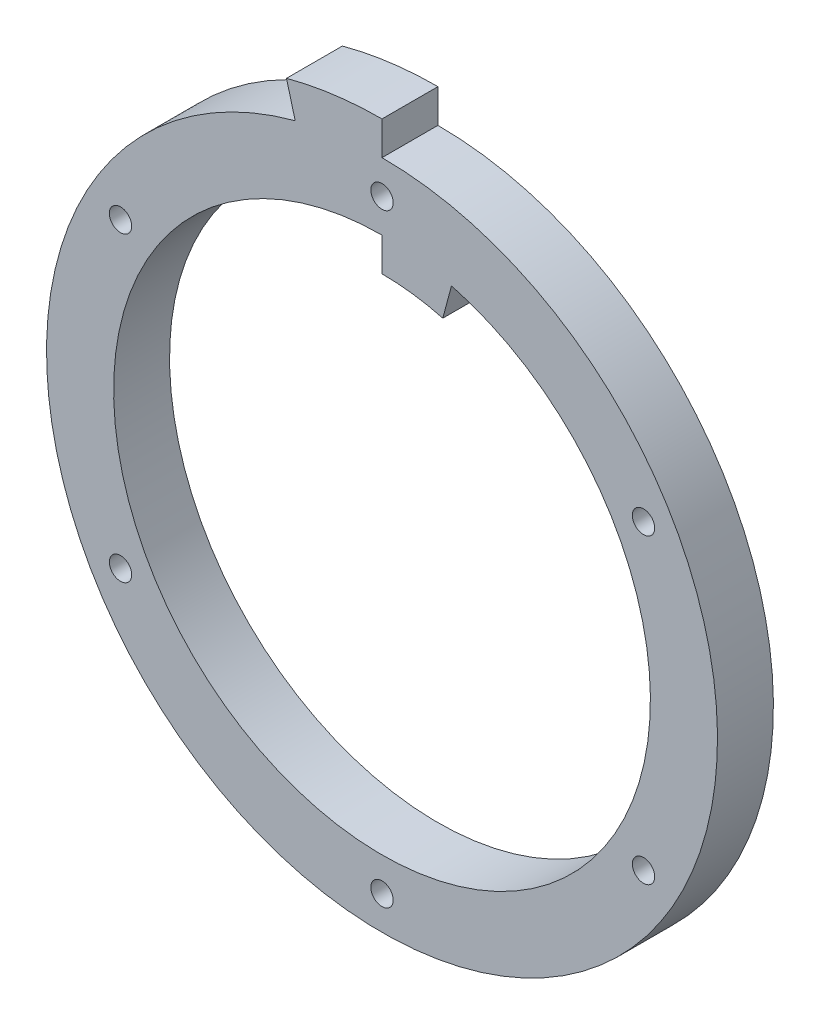
ISO-10303-21;
HEADER;
FILE_DESCRIPTION(('STEP AP214'),'2;1');
FILE_NAME('part.step','',(''),(''),'','','');
FILE_SCHEMA(('AUTOMOTIVE_DESIGN { 1 0 10303 214 1 1 1 1 }'));
ENDSEC;
DATA;
#1=APPLICATION_CONTEXT('core data for automotive mechanical design processes');
#2=APPLICATION_PROTOCOL_DEFINITION('international standard','automotive_design',2000,#1);
#3=PRODUCT_CONTEXT('',#1,'mechanical');
#4=PRODUCT('Part','Part','',(#3));
#5=PRODUCT_RELATED_PRODUCT_CATEGORY('part','',(#4));
#6=PRODUCT_DEFINITION_FORMATION('','',#4);
#7=PRODUCT_DEFINITION_CONTEXT('part definition',#1,'design');
#8=PRODUCT_DEFINITION('design','',#6,#7);
#9=PRODUCT_DEFINITION_SHAPE('','',#8);
#10=(LENGTH_UNIT() NAMED_UNIT(*) SI_UNIT(.MILLI.,.METRE.));
#11=(NAMED_UNIT(*) PLANE_ANGLE_UNIT() SI_UNIT($,.RADIAN.));
#12=(NAMED_UNIT(*) SI_UNIT($,.STERADIAN.) SOLID_ANGLE_UNIT());
#13=UNCERTAINTY_MEASURE_WITH_UNIT(LENGTH_MEASURE(1.E-05),#10,'distance_accuracy_value','');
#14=(GEOMETRIC_REPRESENTATION_CONTEXT(3) GLOBAL_UNCERTAINTY_ASSIGNED_CONTEXT((#13)) GLOBAL_UNIT_ASSIGNED_CONTEXT((#10,
#11,#12)) REPRESENTATION_CONTEXT('',''));
#15=CARTESIAN_POINT('',(0.,0.,0.));
#16=DIRECTION('',(0.,0.,1.));
#17=DIRECTION('',(1.,0.,0.));
#18=AXIS2_PLACEMENT_3D('',#15,#16,#17);
#19=CARTESIAN_POINT('',(0.,0.,5.));
#20=DIRECTION('',(0.,0.,1.));
#21=DIRECTION('',(1.,0.,0.));
#22=AXIS2_PLACEMENT_3D('',#19,#20,#21);
#23=PLANE('',#22);
#24=CARTESIAN_POINT('',(0.,27.,5.));
#25=DIRECTION('',(0.,0.,1.));
#26=DIRECTION('',(1.,0.,0.));
#27=AXIS2_PLACEMENT_3D('',#24,#25,#26);
#28=CIRCLE('',#27,1.);
#29=CARTESIAN_POINT('',(1.,27.,5.));
#30=VERTEX_POINT('',#29);
#31=EDGE_CURVE('E162',#30,#30,#28,.T.);
#32=ORIENTED_EDGE('',*,*,#31,.F.);
#33=EDGE_LOOP('',(#32));
#34=FACE_BOUND('',#33,.T.);
#35=CARTESIAN_POINT('',(-23.3826859021798,13.5,5.));
#36=DIRECTION('',(0.,0.,1.));
#37=DIRECTION('',(1.,0.,0.));
#38=AXIS2_PLACEMENT_3D('',#35,#36,#37);
#39=CIRCLE('',#38,1.);
#40=CARTESIAN_POINT('',(-22.3826859021798,13.5,5.));
#41=VERTEX_POINT('',#40);
#42=EDGE_CURVE('E166',#41,#41,#39,.T.);
#43=ORIENTED_EDGE('',*,*,#42,.F.);
#44=EDGE_LOOP('',(#43));
#45=FACE_BOUND('',#44,.T.);
#46=CARTESIAN_POINT('',(-23.3826859021798,-13.5,5.));
#47=DIRECTION('',(0.,0.,1.));
#48=DIRECTION('',(1.,0.,0.));
#49=AXIS2_PLACEMENT_3D('',#46,#47,#48);
#50=CIRCLE('',#49,1.);
#51=CARTESIAN_POINT('',(-22.3826859021798,-13.5,5.));
#52=VERTEX_POINT('',#51);
#53=EDGE_CURVE('E189',#52,#52,#50,.T.);
#54=ORIENTED_EDGE('',*,*,#53,.F.);
#55=EDGE_LOOP('',(#54));
#56=FACE_BOUND('',#55,.T.);
#57=CARTESIAN_POINT('',(0.,-27.,5.));
#58=DIRECTION('',(0.,0.,1.));
#59=DIRECTION('',(1.,0.,0.));
#60=AXIS2_PLACEMENT_3D('',#57,#58,#59);
#61=CIRCLE('',#60,1.);
#62=CARTESIAN_POINT('',(1.,-27.,5.));
#63=VERTEX_POINT('',#62);
#64=EDGE_CURVE('E183',#63,#63,#61,.T.);
#65=ORIENTED_EDGE('',*,*,#64,.F.);
#66=EDGE_LOOP('',(#65));
#67=FACE_BOUND('',#66,.T.);
#68=CARTESIAN_POINT('',(23.3826859021798,-13.5,5.));
#69=DIRECTION('',(0.,0.,1.));
#70=DIRECTION('',(1.,0.,0.));
#71=AXIS2_PLACEMENT_3D('',#68,#69,#70);
#72=CIRCLE('',#71,1.);
#73=CARTESIAN_POINT('',(24.3826859021798,-13.5,5.));
#74=VERTEX_POINT('',#73);
#75=EDGE_CURVE('E177',#74,#74,#72,.T.);
#76=ORIENTED_EDGE('',*,*,#75,.F.);
#77=EDGE_LOOP('',(#76));
#78=FACE_BOUND('',#77,.T.);
#79=CARTESIAN_POINT('',(23.3826859021798,13.5,5.));
#80=DIRECTION('',(0.,0.,1.));
#81=DIRECTION('',(1.,0.,0.));
#82=AXIS2_PLACEMENT_3D('',#79,#80,#81);
#83=CIRCLE('',#82,1.);
#84=CARTESIAN_POINT('',(24.3826859021798,13.5,5.));
#85=VERTEX_POINT('',#84);
#86=EDGE_CURVE('E165',#85,#85,#83,.T.);
#87=ORIENTED_EDGE('',*,*,#86,.F.);
#88=EDGE_LOOP('',(#87));
#89=FACE_BOUND('',#88,.T.);
#90=CARTESIAN_POINT('',(0.,0.,5.));
#91=DIRECTION('',(0.,0.,1.));
#92=DIRECTION('',(1.,0.,0.));
#93=AXIS2_PLACEMENT_3D('',#90,#91,#92);
#94=CIRCLE('',#93,30.);
#95=CARTESIAN_POINT('',(-7.76457135307565,28.977774788672,5.));
#96=VERTEX_POINT('',#95);
#97=CARTESIAN_POINT('',(0.,30.,5.));
#98=VERTEX_POINT('',#97);
#99=EDGE_CURVE('E11',#96,#98,#94,.T.);
#100=ORIENTED_EDGE('',*,*,#99,.T.);
#101=DIRECTION('',(0.,1.,0.));
#102=VECTOR('',#101,1.);
#103=CARTESIAN_POINT('',(0.,30.,5.));
#104=LINE('',#103,#102);
#105=CARTESIAN_POINT('',(0.,33.,5.));
#106=VERTEX_POINT('',#105);
#107=EDGE_CURVE('E119',#98,#106,#104,.T.);
#108=ORIENTED_EDGE('',*,*,#107,.T.);
#109=CARTESIAN_POINT('',(0.,0.,5.));
#110=DIRECTION('',(0.,0.,1.));
#111=DIRECTION('',(1.,0.,0.));
#112=AXIS2_PLACEMENT_3D('',#109,#110,#111);
#113=CIRCLE('',#112,33.);
#114=CARTESIAN_POINT('',(-8.54102848838322,31.8755522675392,5.));
#115=VERTEX_POINT('',#114);
#116=EDGE_CURVE('E145',#106,#115,#113,.T.);
#117=ORIENTED_EDGE('',*,*,#116,.T.);
#118=DIRECTION('',(0.258819045102522,-0.965925826289068,0.));
#119=VECTOR('',#118,1.);
#120=CARTESIAN_POINT('',(-7.76457135307565,28.977774788672,5.));
#121=LINE('',#120,#119);
#122=EDGE_CURVE('E137',#115,#96,#121,.T.);
#123=ORIENTED_EDGE('',*,*,#122,.T.);
#124=EDGE_LOOP('',(#100,#108,#117,#123));
#125=FACE_BOUND('',#124,.T.);
#126=CARTESIAN_POINT('',(0.,0.,5.));
#127=DIRECTION('',(0.,0.,1.));
#128=DIRECTION('',(1.,0.,0.));
#129=AXIS2_PLACEMENT_3D('',#126,#127,#128);
#130=CIRCLE('',#129,24.);
#131=CARTESIAN_POINT('',(0.,24.,5.));
#132=VERTEX_POINT('',#131);
#133=CARTESIAN_POINT('',(6.21165708246034,23.1822198309377,5.));
#134=VERTEX_POINT('',#133);
#135=EDGE_CURVE('E122',#132,#134,#130,.T.);
#136=ORIENTED_EDGE('',*,*,#135,.F.);
#137=DIRECTION('',(0.,-1.,0.));
#138=VECTOR('',#137,1.);
#139=CARTESIAN_POINT('',(0.,24.,5.));
#140=LINE('',#139,#138);
#141=CARTESIAN_POINT('',(0.,21.,5.));
#142=VERTEX_POINT('',#141);
#143=EDGE_CURVE('E104',#132,#142,#140,.T.);
#144=ORIENTED_EDGE('',*,*,#143,.T.);
#145=CARTESIAN_POINT('',(0.,0.,5.));
#146=DIRECTION('',(0.,0.,-1.));
#147=DIRECTION('',(1.,0.,0.));
#148=AXIS2_PLACEMENT_3D('',#145,#146,#147);
#149=CIRCLE('',#148,21.);
#150=CARTESIAN_POINT('',(5.4351999471528,20.2844423520705,5.));
#151=VERTEX_POINT('',#150);
#152=EDGE_CURVE('E113',#142,#151,#149,.T.);
#153=ORIENTED_EDGE('',*,*,#152,.T.);
#154=DIRECTION('',(0.258819045102514,0.96592582628907,0.));
#155=VECTOR('',#154,1.);
#156=CARTESIAN_POINT('',(5.4351999471528,20.2844423520705,5.));
#157=LINE('',#156,#155);
#158=EDGE_CURVE('E120',#151,#134,#157,.T.);
#159=ORIENTED_EDGE('',*,*,#158,.T.);
#160=EDGE_LOOP('',(#136,#144,#153,#159));
#161=FACE_BOUND('',#160,.T.);
#162=ADVANCED_FACE('F36',(#34,#45,#56,#67,#78,#89,#125,#161),#23,.T.);
#163=CARTESIAN_POINT('',(0.,0.,0.));
#164=DIRECTION('',(0.,0.,1.));
#165=DIRECTION('',(1.,0.,0.));
#166=AXIS2_PLACEMENT_3D('',#163,#164,#165);
#167=PLANE('',#166);
#168=CARTESIAN_POINT('',(0.,27.,0.));
#169=DIRECTION('',(0.,0.,1.));
#170=DIRECTION('',(1.,0.,0.));
#171=AXIS2_PLACEMENT_3D('',#168,#169,#170);
#172=CIRCLE('',#171,1.);
#173=CARTESIAN_POINT('',(1.,27.,0.));
#174=VERTEX_POINT('',#173);
#175=EDGE_CURVE('E159',#174,#174,#172,.T.);
#176=ORIENTED_EDGE('',*,*,#175,.T.);
#177=EDGE_LOOP('',(#176));
#178=FACE_BOUND('',#177,.T.);
#179=CARTESIAN_POINT('',(-23.3826859021798,13.5,0.));
#180=DIRECTION('',(0.,0.,1.));
#181=DIRECTION('',(1.,0.,0.));
#182=AXIS2_PLACEMENT_3D('',#179,#180,#181);
#183=CIRCLE('',#182,1.);
#184=CARTESIAN_POINT('',(-22.3826859021798,13.5,0.));
#185=VERTEX_POINT('',#184);
#186=EDGE_CURVE('E152',#185,#185,#183,.T.);
#187=ORIENTED_EDGE('',*,*,#186,.T.);
#188=EDGE_LOOP('',(#187));
#189=FACE_BOUND('',#188,.T.);
#190=CARTESIAN_POINT('',(-23.3826859021798,-13.5,0.));
#191=DIRECTION('',(0.,0.,1.));
#192=DIRECTION('',(1.,0.,0.));
#193=AXIS2_PLACEMENT_3D('',#190,#191,#192);
#194=CIRCLE('',#193,1.);
#195=CARTESIAN_POINT('',(-22.3826859021798,-13.5,0.));
#196=VERTEX_POINT('',#195);
#197=EDGE_CURVE('E169',#196,#196,#194,.T.);
#198=ORIENTED_EDGE('',*,*,#197,.T.);
#199=EDGE_LOOP('',(#198));
#200=FACE_BOUND('',#199,.T.);
#201=CARTESIAN_POINT('',(0.,-27.,0.));
#202=DIRECTION('',(0.,0.,1.));
#203=DIRECTION('',(1.,0.,0.));
#204=AXIS2_PLACEMENT_3D('',#201,#202,#203);
#205=CIRCLE('',#204,1.);
#206=CARTESIAN_POINT('',(1.,-27.,0.));
#207=VERTEX_POINT('',#206);
#208=EDGE_CURVE('E186',#207,#207,#205,.T.);
#209=ORIENTED_EDGE('',*,*,#208,.T.);
#210=EDGE_LOOP('',(#209));
#211=FACE_BOUND('',#210,.T.);
#212=CARTESIAN_POINT('',(23.3826859021798,-13.5,0.));
#213=DIRECTION('',(0.,0.,1.));
#214=DIRECTION('',(1.,0.,0.));
#215=AXIS2_PLACEMENT_3D('',#212,#213,#214);
#216=CIRCLE('',#215,1.);
#217=CARTESIAN_POINT('',(24.3826859021798,-13.5,0.));
#218=VERTEX_POINT('',#217);
#219=EDGE_CURVE('E180',#218,#218,#216,.T.);
#220=ORIENTED_EDGE('',*,*,#219,.T.);
#221=EDGE_LOOP('',(#220));
#222=FACE_BOUND('',#221,.T.);
#223=CARTESIAN_POINT('',(23.3826859021798,13.5,0.));
#224=DIRECTION('',(0.,0.,1.));
#225=DIRECTION('',(1.,0.,0.));
#226=AXIS2_PLACEMENT_3D('',#223,#224,#225);
#227=CIRCLE('',#226,1.);
#228=CARTESIAN_POINT('',(24.3826859021798,13.5,0.));
#229=VERTEX_POINT('',#228);
#230=EDGE_CURVE('E174',#229,#229,#227,.T.);
#231=ORIENTED_EDGE('',*,*,#230,.T.);
#232=EDGE_LOOP('',(#231));
#233=FACE_BOUND('',#232,.T.);
#234=CARTESIAN_POINT('',(0.,0.,0.));
#235=DIRECTION('',(0.,0.,1.));
#236=DIRECTION('',(1.,0.,0.));
#237=AXIS2_PLACEMENT_3D('',#234,#235,#236);
#238=CIRCLE('',#237,30.);
#239=CARTESIAN_POINT('',(-7.76457135307565,28.977774788672,0.));
#240=VERTEX_POINT('',#239);
#241=CARTESIAN_POINT('',(0.,30.,0.));
#242=VERTEX_POINT('',#241);
#243=EDGE_CURVE('E40',#240,#242,#238,.T.);
#244=ORIENTED_EDGE('',*,*,#243,.F.);
#245=DIRECTION('',(0.258819045102522,-0.965925826289068,0.));
#246=VECTOR('',#245,1.);
#247=CARTESIAN_POINT('',(-7.76457135307565,28.977774788672,0.));
#248=LINE('',#247,#246);
#249=CARTESIAN_POINT('',(-8.54102848838322,31.8755522675392,0.));
#250=VERTEX_POINT('',#249);
#251=EDGE_CURVE('E140',#250,#240,#248,.T.);
#252=ORIENTED_EDGE('',*,*,#251,.F.);
#253=CARTESIAN_POINT('',(0.,0.,0.));
#254=DIRECTION('',(0.,0.,1.));
#255=DIRECTION('',(1.,0.,0.));
#256=AXIS2_PLACEMENT_3D('',#253,#254,#255);
#257=CIRCLE('',#256,33.);
#258=CARTESIAN_POINT('',(0.,33.,0.));
#259=VERTEX_POINT('',#258);
#260=EDGE_CURVE('E136',#259,#250,#257,.T.);
#261=ORIENTED_EDGE('',*,*,#260,.F.);
#262=DIRECTION('',(0.,1.,0.));
#263=VECTOR('',#262,1.);
#264=CARTESIAN_POINT('',(0.,30.,0.));
#265=LINE('',#264,#263);
#266=EDGE_CURVE('E133',#242,#259,#265,.T.);
#267=ORIENTED_EDGE('',*,*,#266,.F.);
#268=EDGE_LOOP('',(#244,#252,#261,#267));
#269=FACE_BOUND('',#268,.T.);
#270=CARTESIAN_POINT('',(0.,0.,0.));
#271=DIRECTION('',(0.,0.,1.));
#272=DIRECTION('',(1.,0.,0.));
#273=AXIS2_PLACEMENT_3D('',#270,#271,#272);
#274=CIRCLE('',#273,24.);
#275=CARTESIAN_POINT('',(0.,24.,0.));
#276=VERTEX_POINT('',#275);
#277=CARTESIAN_POINT('',(6.21165708246034,23.1822198309377,0.));
#278=VERTEX_POINT('',#277);
#279=EDGE_CURVE('E51',#276,#278,#274,.T.);
#280=ORIENTED_EDGE('',*,*,#279,.T.);
#281=DIRECTION('',(0.258819045102514,0.96592582628907,0.));
#282=VECTOR('',#281,1.);
#283=CARTESIAN_POINT('',(5.4351999471528,20.2844423520705,0.));
#284=LINE('',#283,#282);
#285=CARTESIAN_POINT('',(5.4351999471528,20.2844423520705,0.));
#286=VERTEX_POINT('',#285);
#287=EDGE_CURVE('E126',#286,#278,#284,.T.);
#288=ORIENTED_EDGE('',*,*,#287,.F.);
#289=CARTESIAN_POINT('',(0.,0.,0.));
#290=DIRECTION('',(0.,0.,-1.));
#291=DIRECTION('',(1.,0.,0.));
#292=AXIS2_PLACEMENT_3D('',#289,#290,#291);
#293=CIRCLE('',#292,21.);
#294=CARTESIAN_POINT('',(0.,21.,0.));
#295=VERTEX_POINT('',#294);
#296=EDGE_CURVE('E123',#295,#286,#293,.T.);
#297=ORIENTED_EDGE('',*,*,#296,.F.);
#298=DIRECTION('',(0.,-1.,0.));
#299=VECTOR('',#298,1.);
#300=CARTESIAN_POINT('',(0.,24.,0.));
#301=LINE('',#300,#299);
#302=EDGE_CURVE('E106',#276,#295,#301,.T.);
#303=ORIENTED_EDGE('',*,*,#302,.F.);
#304=EDGE_LOOP('',(#280,#288,#297,#303));
#305=FACE_BOUND('',#304,.T.);
#306=ADVANCED_FACE('F197',(#178,#189,#200,#211,#222,#233,#269,#305),#167,.F.);
#307=CARTESIAN_POINT('',(0.,0.,5.));
#308=DIRECTION('',(0.,0.,-1.));
#309=DIRECTION('',(-1.,0.,0.));
#310=AXIS2_PLACEMENT_3D('',#307,#308,#309);
#311=CYLINDRICAL_SURFACE('',#310,30.);
#312=ORIENTED_EDGE('',*,*,#99,.F.);
#313=DIRECTION('',(0.,0.,1.));
#314=VECTOR('',#313,1.);
#315=CARTESIAN_POINT('',(-7.76457135307565,28.977774788672,0.));
#316=LINE('',#315,#314);
#317=EDGE_CURVE('E149',#240,#96,#316,.T.);
#318=ORIENTED_EDGE('',*,*,#317,.F.);
#319=ORIENTED_EDGE('',*,*,#243,.T.);
#320=DIRECTION('',(0.,0.,1.));
#321=VECTOR('',#320,1.);
#322=CARTESIAN_POINT('',(0.,30.,0.));
#323=LINE('',#322,#321);
#324=EDGE_CURVE('E142',#242,#98,#323,.T.);
#325=ORIENTED_EDGE('',*,*,#324,.T.);
#326=EDGE_LOOP('',(#312,#318,#319,#325));
#327=FACE_BOUND('',#326,.T.);
#328=ADVANCED_FACE('F38',(#327),#311,.T.);
#329=CARTESIAN_POINT('',(0.,0.,5.));
#330=DIRECTION('',(0.,0.,-1.));
#331=DIRECTION('',(-1.,0.,0.));
#332=AXIS2_PLACEMENT_3D('',#329,#330,#331);
#333=CYLINDRICAL_SURFACE('',#332,24.);
#334=DIRECTION('',(0.,0.,1.));
#335=VECTOR('',#334,1.);
#336=CARTESIAN_POINT('',(0.,24.,0.));
#337=LINE('',#336,#335);
#338=EDGE_CURVE('E110',#276,#132,#337,.T.);
#339=ORIENTED_EDGE('',*,*,#338,.T.);
#340=ORIENTED_EDGE('',*,*,#135,.T.);
#341=DIRECTION('',(0.,0.,1.));
#342=VECTOR('',#341,1.);
#343=CARTESIAN_POINT('',(6.21165708246034,23.1822198309377,0.));
#344=LINE('',#343,#342);
#345=EDGE_CURVE('E56',#278,#134,#344,.T.);
#346=ORIENTED_EDGE('',*,*,#345,.F.);
#347=ORIENTED_EDGE('',*,*,#279,.F.);
#348=EDGE_LOOP('',(#339,#340,#346,#347));
#349=FACE_BOUND('',#348,.T.);
#350=ADVANCED_FACE('F202',(#349),#333,.F.);
#351=CARTESIAN_POINT('',(23.3826859021798,13.5,0.));
#352=DIRECTION('',(0.,0.,1.));
#353=DIRECTION('',(1.,0.,0.));
#354=AXIS2_PLACEMENT_3D('',#351,#352,#353);
#355=CYLINDRICAL_SURFACE('',#354,1.);
#356=ORIENTED_EDGE('',*,*,#230,.F.);
#357=EDGE_LOOP('',(#356));
#358=FACE_BOUND('',#357,.T.);
#359=ORIENTED_EDGE('',*,*,#86,.T.);
#360=EDGE_LOOP('',(#359));
#361=FACE_BOUND('',#360,.T.);
#362=ADVANCED_FACE('F204',(#358,#361),#355,.F.);
#363=CARTESIAN_POINT('',(23.3826859021798,-13.5,0.));
#364=DIRECTION('',(0.,0.,1.));
#365=DIRECTION('',(1.,0.,0.));
#366=AXIS2_PLACEMENT_3D('',#363,#364,#365);
#367=CYLINDRICAL_SURFACE('',#366,1.);
#368=ORIENTED_EDGE('',*,*,#219,.F.);
#369=EDGE_LOOP('',(#368));
#370=FACE_BOUND('',#369,.T.);
#371=ORIENTED_EDGE('',*,*,#75,.T.);
#372=EDGE_LOOP('',(#371));
#373=FACE_BOUND('',#372,.T.);
#374=ADVANCED_FACE('F210',(#370,#373),#367,.F.);
#375=CARTESIAN_POINT('',(0.,-27.,0.));
#376=DIRECTION('',(0.,0.,1.));
#377=DIRECTION('',(1.,0.,0.));
#378=AXIS2_PLACEMENT_3D('',#375,#376,#377);
#379=CYLINDRICAL_SURFACE('',#378,1.);
#380=ORIENTED_EDGE('',*,*,#208,.F.);
#381=EDGE_LOOP('',(#380));
#382=FACE_BOUND('',#381,.T.);
#383=ORIENTED_EDGE('',*,*,#64,.T.);
#384=EDGE_LOOP('',(#383));
#385=FACE_BOUND('',#384,.T.);
#386=ADVANCED_FACE('F272',(#382,#385),#379,.F.);
#387=CARTESIAN_POINT('',(-23.3826859021798,-13.5,0.));
#388=DIRECTION('',(0.,0.,1.));
#389=DIRECTION('',(1.,0.,0.));
#390=AXIS2_PLACEMENT_3D('',#387,#388,#389);
#391=CYLINDRICAL_SURFACE('',#390,1.);
#392=ORIENTED_EDGE('',*,*,#197,.F.);
#393=EDGE_LOOP('',(#392));
#394=FACE_BOUND('',#393,.T.);
#395=ORIENTED_EDGE('',*,*,#53,.T.);
#396=EDGE_LOOP('',(#395));
#397=FACE_BOUND('',#396,.T.);
#398=ADVANCED_FACE('F267',(#394,#397),#391,.F.);
#399=CARTESIAN_POINT('',(-23.3826859021798,13.5,0.));
#400=DIRECTION('',(0.,0.,1.));
#401=DIRECTION('',(1.,0.,0.));
#402=AXIS2_PLACEMENT_3D('',#399,#400,#401);
#403=CYLINDRICAL_SURFACE('',#402,1.);
#404=ORIENTED_EDGE('',*,*,#186,.F.);
#405=EDGE_LOOP('',(#404));
#406=FACE_BOUND('',#405,.T.);
#407=ORIENTED_EDGE('',*,*,#42,.T.);
#408=EDGE_LOOP('',(#407));
#409=FACE_BOUND('',#408,.T.);
#410=ADVANCED_FACE('F258',(#406,#409),#403,.F.);
#411=CARTESIAN_POINT('',(0.,27.,0.));
#412=DIRECTION('',(0.,0.,1.));
#413=DIRECTION('',(1.,0.,0.));
#414=AXIS2_PLACEMENT_3D('',#411,#412,#413);
#415=CYLINDRICAL_SURFACE('',#414,1.);
#416=ORIENTED_EDGE('',*,*,#175,.F.);
#417=EDGE_LOOP('',(#416));
#418=FACE_BOUND('',#417,.T.);
#419=ORIENTED_EDGE('',*,*,#31,.T.);
#420=EDGE_LOOP('',(#419));
#421=FACE_BOUND('',#420,.T.);
#422=ADVANCED_FACE('F251',(#418,#421),#415,.F.);
#423=CARTESIAN_POINT('',(-7.76457135307565,28.977774788672,0.));
#424=DIRECTION('',(-0.965925826289068,-0.258819045102522,0.));
#425=DIRECTION('',(0.258819045102522,-0.965925826289068,0.));
#426=AXIS2_PLACEMENT_3D('',#423,#424,#425);
#427=PLANE('',#426);
#428=ORIENTED_EDGE('',*,*,#122,.F.);
#429=DIRECTION('',(0.,0.,1.));
#430=VECTOR('',#429,1.);
#431=CARTESIAN_POINT('',(-8.54102848838322,31.8755522675392,0.));
#432=LINE('',#431,#430);
#433=EDGE_CURVE('E153',#250,#115,#432,.T.);
#434=ORIENTED_EDGE('',*,*,#433,.F.);
#435=ORIENTED_EDGE('',*,*,#251,.T.);
#436=ORIENTED_EDGE('',*,*,#317,.T.);
#437=EDGE_LOOP('',(#428,#434,#435,#436));
#438=FACE_BOUND('',#437,.T.);
#439=ADVANCED_FACE('F249',(#438),#427,.T.);
#440=CARTESIAN_POINT('',(0.,0.,0.));
#441=DIRECTION('',(0.,0.,1.));
#442=DIRECTION('',(1.,0.,0.));
#443=AXIS2_PLACEMENT_3D('',#440,#441,#442);
#444=CYLINDRICAL_SURFACE('',#443,33.);
#445=ORIENTED_EDGE('',*,*,#116,.F.);
#446=DIRECTION('',(0.,0.,1.));
#447=VECTOR('',#446,1.);
#448=CARTESIAN_POINT('',(0.,33.,0.));
#449=LINE('',#448,#447);
#450=EDGE_CURVE('E155',#259,#106,#449,.T.);
#451=ORIENTED_EDGE('',*,*,#450,.F.);
#452=ORIENTED_EDGE('',*,*,#260,.T.);
#453=ORIENTED_EDGE('',*,*,#433,.T.);
#454=EDGE_LOOP('',(#445,#451,#452,#453));
#455=FACE_BOUND('',#454,.T.);
#456=ADVANCED_FACE('F247',(#455),#444,.T.);
#457=CARTESIAN_POINT('',(0.,30.,0.));
#458=DIRECTION('',(1.,0.,0.));
#459=DIRECTION('',(0.,0.,-1.));
#460=AXIS2_PLACEMENT_3D('',#457,#458,#459);
#461=PLANE('',#460);
#462=ORIENTED_EDGE('',*,*,#107,.F.);
#463=ORIENTED_EDGE('',*,*,#324,.F.);
#464=ORIENTED_EDGE('',*,*,#266,.T.);
#465=ORIENTED_EDGE('',*,*,#450,.T.);
#466=EDGE_LOOP('',(#462,#463,#464,#465));
#467=FACE_BOUND('',#466,.T.);
#468=ADVANCED_FACE('F241',(#467),#461,.T.);
#469=CARTESIAN_POINT('',(0.,0.,0.));
#470=DIRECTION('',(0.,0.,1.));
#471=DIRECTION('',(1.,0.,0.));
#472=AXIS2_PLACEMENT_3D('',#469,#470,#471);
#473=CYLINDRICAL_SURFACE('',#472,21.);
#474=ORIENTED_EDGE('',*,*,#152,.F.);
#475=DIRECTION('',(0.,0.,1.));
#476=VECTOR('',#475,1.);
#477=CARTESIAN_POINT('',(0.,21.,0.));
#478=LINE('',#477,#476);
#479=EDGE_CURVE('E100',#295,#142,#478,.T.);
#480=ORIENTED_EDGE('',*,*,#479,.F.);
#481=ORIENTED_EDGE('',*,*,#296,.T.);
#482=DIRECTION('',(0.,0.,1.));
#483=VECTOR('',#482,1.);
#484=CARTESIAN_POINT('',(5.4351999471528,20.2844423520705,0.));
#485=LINE('',#484,#483);
#486=EDGE_CURVE('E115',#286,#151,#485,.T.);
#487=ORIENTED_EDGE('',*,*,#486,.T.);
#488=EDGE_LOOP('',(#474,#480,#481,#487));
#489=FACE_BOUND('',#488,.T.);
#490=ADVANCED_FACE('F114',(#489),#473,.F.);
#491=CARTESIAN_POINT('',(0.,24.,0.));
#492=DIRECTION('',(-1.,0.,0.));
#493=DIRECTION('',(0.,0.,1.));
#494=AXIS2_PLACEMENT_3D('',#491,#492,#493);
#495=PLANE('',#494);
#496=ORIENTED_EDGE('',*,*,#143,.F.);
#497=ORIENTED_EDGE('',*,*,#338,.F.);
#498=ORIENTED_EDGE('',*,*,#302,.T.);
#499=ORIENTED_EDGE('',*,*,#479,.T.);
#500=EDGE_LOOP('',(#496,#497,#498,#499));
#501=FACE_BOUND('',#500,.T.);
#502=ADVANCED_FACE('F102',(#501),#495,.T.);
#503=CARTESIAN_POINT('',(5.4351999471528,20.2844423520705,0.));
#504=DIRECTION('',(0.96592582628907,-0.258819045102514,0.));
#505=DIRECTION('',(0.258819045102514,0.96592582628907,0.));
#506=AXIS2_PLACEMENT_3D('',#503,#504,#505);
#507=PLANE('',#506);
#508=ORIENTED_EDGE('',*,*,#158,.F.);
#509=ORIENTED_EDGE('',*,*,#486,.F.);
#510=ORIENTED_EDGE('',*,*,#287,.T.);
#511=ORIENTED_EDGE('',*,*,#345,.T.);
#512=EDGE_LOOP('',(#508,#509,#510,#511));
#513=FACE_BOUND('',#512,.T.);
#514=ADVANCED_FACE('F199',(#513),#507,.T.);
#515=CLOSED_SHELL('',(#162,#306,#328,#350,#362,#374,#386,#398,#410,#422,#439,#456,#468,#490,
#502,#514));
#516=MANIFOLD_SOLID_BREP('B2',#515);
#517=ADVANCED_BREP_SHAPE_REPRESENTATION('',(#18,#516),#14);
#518=SHAPE_DEFINITION_REPRESENTATION(#9,#517);
ENDSEC;
END-ISO-10303-21;
